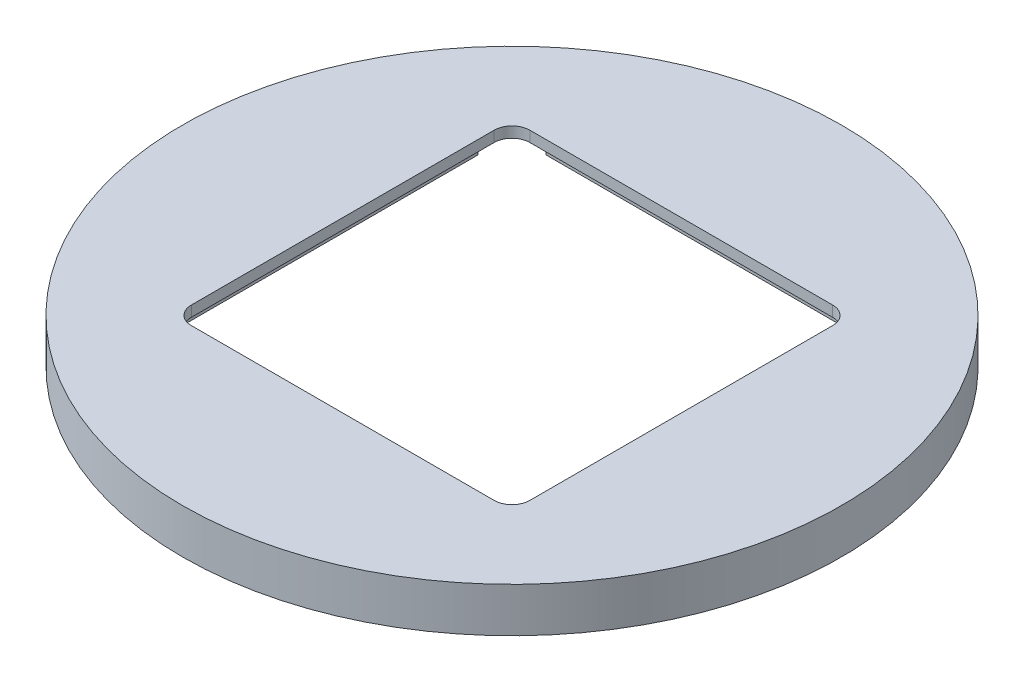
ISO-10303-21;
HEADER;
FILE_DESCRIPTION(('STEP AP214'),'2;1');
FILE_NAME('part.step','',(''),(''),'','','');
FILE_SCHEMA(('AUTOMOTIVE_DESIGN { 1 0 10303 214 1 1 1 1 }'));
ENDSEC;
DATA;
#1=APPLICATION_CONTEXT('core data for automotive mechanical design processes');
#2=APPLICATION_PROTOCOL_DEFINITION('international standard','automotive_design',2000,#1);
#3=PRODUCT_CONTEXT('',#1,'mechanical');
#4=PRODUCT('Part','Part','',(#3));
#5=PRODUCT_RELATED_PRODUCT_CATEGORY('part','',(#4));
#6=PRODUCT_DEFINITION_FORMATION('','',#4);
#7=PRODUCT_DEFINITION_CONTEXT('part definition',#1,'design');
#8=PRODUCT_DEFINITION('design','',#6,#7);
#9=PRODUCT_DEFINITION_SHAPE('','',#8);
#10=(LENGTH_UNIT() NAMED_UNIT(*) SI_UNIT(.MILLI.,.METRE.));
#11=(NAMED_UNIT(*) PLANE_ANGLE_UNIT() SI_UNIT($,.RADIAN.));
#12=(NAMED_UNIT(*) SI_UNIT($,.STERADIAN.) SOLID_ANGLE_UNIT());
#13=UNCERTAINTY_MEASURE_WITH_UNIT(LENGTH_MEASURE(1.E-05),#10,'distance_accuracy_value','');
#14=(GEOMETRIC_REPRESENTATION_CONTEXT(3) GLOBAL_UNCERTAINTY_ASSIGNED_CONTEXT((#13)) GLOBAL_UNIT_ASSIGNED_CONTEXT((#10,
#11,#12)) REPRESENTATION_CONTEXT('',''));
#15=CARTESIAN_POINT('',(0.,0.,0.));
#16=DIRECTION('',(0.,0.,1.));
#17=DIRECTION('',(1.,0.,0.));
#18=AXIS2_PLACEMENT_3D('',#15,#16,#17);
#19=CARTESIAN_POINT('',(-32.6337342069294,2.5,0.));
#20=DIRECTION('',(1.,0.,0.));
#21=DIRECTION('',(0.,0.,-1.));
#22=AXIS2_PLACEMENT_3D('',#19,#20,#21);
#23=PLANE('',#22);
#24=DIRECTION('',(0.,-1.,0.));
#25=VECTOR('',#24,1.);
#26=CARTESIAN_POINT('',(-32.6337342069294,6.14264068711932,-8.71443994882699));
#27=LINE('',#26,#25);
#28=CARTESIAN_POINT('',(-32.6337342069294,1.9,-8.71443994882699));
#29=VERTEX_POINT('',#28);
#30=CARTESIAN_POINT('',(-32.6337342069294,0.,-8.71443994882699));
#31=VERTEX_POINT('',#30);
#32=EDGE_CURVE('E52',#29,#31,#27,.T.);
#33=ORIENTED_EDGE('',*,*,#32,.F.);
#34=DIRECTION('',(0.,0.,-1.));
#35=VECTOR('',#34,1.);
#36=CARTESIAN_POINT('',(-32.6337342069294,1.9,0.));
#37=LINE('',#36,#35);
#38=CARTESIAN_POINT('',(-32.6337342069294,1.9,9.9571329264268));
#39=VERTEX_POINT('',#38);
#40=EDGE_CURVE('E257',#39,#29,#37,.T.);
#41=ORIENTED_EDGE('',*,*,#40,.F.);
#42=DIRECTION('',(0.,-1.,0.));
#43=VECTOR('',#42,1.);
#44=CARTESIAN_POINT('',(-32.6337342069294,6.14264068711932,9.9571329264268));
#45=LINE('',#44,#43);
#46=CARTESIAN_POINT('',(-32.6337342069294,0.,9.9571329264268));
#47=VERTEX_POINT('',#46);
#48=EDGE_CURVE('E249',#47,#39,#45,.F.);
#49=ORIENTED_EDGE('',*,*,#48,.F.);
#50=DIRECTION('',(0.,0.,1.));
#51=VECTOR('',#50,1.);
#52=CARTESIAN_POINT('',(-32.6337342069294,0.,0.));
#53=LINE('',#52,#51);
#54=EDGE_CURVE('E169',#31,#47,#53,.T.);
#55=ORIENTED_EDGE('',*,*,#54,.F.);
#56=EDGE_LOOP('',(#33,#41,#49,#55));
#57=FACE_BOUND('',#56,.T.);
#58=ADVANCED_FACE('F37',(#57),#23,.T.);
#59=CARTESIAN_POINT('',(0.,2.5,-10.6286535112001));
#60=DIRECTION('',(0.,0.,1.));
#61=DIRECTION('',(1.,0.,0.));
#62=AXIS2_PLACEMENT_3D('',#59,#60,#61);
#63=PLANE('',#62);
#64=DIRECTION('',(0.,-1.,0.));
#65=VECTOR('',#64,1.);
#66=CARTESIAN_POINT('',(-30.7195206445563,6.14264068711932,-10.6286535112001));
#67=LINE('',#66,#65);
#68=CARTESIAN_POINT('',(-30.7195206445563,0.,-10.6286535112001));
#69=VERTEX_POINT('',#68);
#70=CARTESIAN_POINT('',(-30.7195206445563,1.9,-10.6286535112001));
#71=VERTEX_POINT('',#70);
#72=EDGE_CURVE('E150',#69,#71,#67,.F.);
#73=ORIENTED_EDGE('',*,*,#72,.F.);
#74=DIRECTION('',(-1.,0.,0.));
#75=VECTOR('',#74,1.);
#76=CARTESIAN_POINT('',(0.,0.,-10.6286535112001));
#77=LINE('',#76,#75);
#78=CARTESIAN_POINT('',(-12.0479477693025,0.,-10.6286535112001));
#79=VERTEX_POINT('',#78);
#80=EDGE_CURVE('E161',#79,#69,#77,.T.);
#81=ORIENTED_EDGE('',*,*,#80,.F.);
#82=DIRECTION('',(0.,-1.,0.));
#83=VECTOR('',#82,1.);
#84=CARTESIAN_POINT('',(-12.0479477693025,6.14264068711932,-10.6286535112001));
#85=LINE('',#84,#83);
#86=CARTESIAN_POINT('',(-12.0479477693025,1.9,-10.6286535112001));
#87=VERTEX_POINT('',#86);
#88=EDGE_CURVE('E60',#87,#79,#85,.T.);
#89=ORIENTED_EDGE('',*,*,#88,.F.);
#90=DIRECTION('',(1.,0.,0.));
#91=VECTOR('',#90,1.);
#92=CARTESIAN_POINT('',(0.,1.9,-10.6286535112001));
#93=LINE('',#92,#91);
#94=EDGE_CURVE('E162',#71,#87,#93,.T.);
#95=ORIENTED_EDGE('',*,*,#94,.F.);
#96=EDGE_LOOP('',(#73,#81,#89,#95));
#97=FACE_BOUND('',#96,.T.);
#98=ADVANCED_FACE('F160',(#97),#63,.T.);
#99=CARTESIAN_POINT('',(-10.1337342069294,2.5,0.));
#100=DIRECTION('',(1.,0.,0.));
#101=DIRECTION('',(0.,0.,-1.));
#102=AXIS2_PLACEMENT_3D('',#99,#100,#101);
#103=PLANE('',#102);
#104=DIRECTION('',(0.,0.,1.));
#105=VECTOR('',#104,1.);
#106=CARTESIAN_POINT('',(-10.1337342069294,1.9,0.));
#107=LINE('',#106,#105);
#108=CARTESIAN_POINT('',(-10.1337342069295,1.9,-8.71443994882699));
#109=VERTEX_POINT('',#108);
#110=CARTESIAN_POINT('',(-10.1337342069294,1.9,9.95713292642681));
#111=VERTEX_POINT('',#110);
#112=EDGE_CURVE('E262',#109,#111,#107,.T.);
#113=ORIENTED_EDGE('',*,*,#112,.F.);
#114=DIRECTION('',(0.,-1.,0.));
#115=VECTOR('',#114,1.);
#116=CARTESIAN_POINT('',(-10.1337342069295,6.14264068711932,-8.71443994882699));
#117=LINE('',#116,#115);
#118=CARTESIAN_POINT('',(-10.1337342069295,0.,-8.71443994882699));
#119=VERTEX_POINT('',#118);
#120=EDGE_CURVE('E584',#109,#119,#117,.T.);
#121=ORIENTED_EDGE('',*,*,#120,.T.);
#122=DIRECTION('',(0.,0.,1.));
#123=VECTOR('',#122,1.);
#124=CARTESIAN_POINT('',(-10.1337342069294,0.,0.));
#125=LINE('',#124,#123);
#126=CARTESIAN_POINT('',(-10.1337342069294,0.,9.95713292642681));
#127=VERTEX_POINT('',#126);
#128=EDGE_CURVE('E168',#119,#127,#125,.T.);
#129=ORIENTED_EDGE('',*,*,#128,.T.);
#130=DIRECTION('',(0.,-1.,0.));
#131=VECTOR('',#130,1.);
#132=CARTESIAN_POINT('',(-10.1337342069294,6.14264068711932,9.95713292642681));
#133=LINE('',#132,#131);
#134=EDGE_CURVE('E557',#127,#111,#133,.F.);
#135=ORIENTED_EDGE('',*,*,#134,.T.);
#136=EDGE_LOOP('',(#113,#121,#129,#135));
#137=FACE_BOUND('',#136,.T.);
#138=ADVANCED_FACE('F320',(#137),#103,.F.);
#139=CARTESIAN_POINT('',(0.,2.5,11.8713464887999));
#140=DIRECTION('',(0.,0.,1.));
#141=DIRECTION('',(1.,0.,0.));
#142=AXIS2_PLACEMENT_3D('',#139,#140,#141);
#143=PLANE('',#142);
#144=DIRECTION('',(-1.,0.,0.));
#145=VECTOR('',#144,1.);
#146=CARTESIAN_POINT('',(0.,1.9,11.8713464887999));
#147=LINE('',#146,#145);
#148=CARTESIAN_POINT('',(-12.0479477693025,1.9,11.8713464887999));
#149=VERTEX_POINT('',#148);
#150=CARTESIAN_POINT('',(-30.7195206445563,1.9,11.8713464887999));
#151=VERTEX_POINT('',#150);
#152=EDGE_CURVE('E260',#149,#151,#147,.T.);
#153=ORIENTED_EDGE('',*,*,#152,.F.);
#154=DIRECTION('',(0.,-1.,0.));
#155=VECTOR('',#154,1.);
#156=CARTESIAN_POINT('',(-12.0479477693025,6.14264068711932,11.8713464887999));
#157=LINE('',#156,#155);
#158=CARTESIAN_POINT('',(-12.0479477693025,0.,11.8713464887999));
#159=VERTEX_POINT('',#158);
#160=EDGE_CURVE('E554',#149,#159,#157,.T.);
#161=ORIENTED_EDGE('',*,*,#160,.T.);
#162=DIRECTION('',(-1.,0.,0.));
#163=VECTOR('',#162,1.);
#164=CARTESIAN_POINT('',(0.,0.,11.8713464887999));
#165=LINE('',#164,#163);
#166=CARTESIAN_POINT('',(-30.7195206445563,0.,11.8713464887999));
#167=VERTEX_POINT('',#166);
#168=EDGE_CURVE('E171',#159,#167,#165,.T.);
#169=ORIENTED_EDGE('',*,*,#168,.T.);
#170=DIRECTION('',(0.,-1.,0.));
#171=VECTOR('',#170,1.);
#172=CARTESIAN_POINT('',(-30.7195206445563,6.14264068711932,11.8713464887999));
#173=LINE('',#172,#171);
#174=EDGE_CURVE('E572',#167,#151,#173,.F.);
#175=ORIENTED_EDGE('',*,*,#174,.T.);
#176=EDGE_LOOP('',(#153,#161,#169,#175));
#177=FACE_BOUND('',#176,.T.);
#178=ADVANCED_FACE('F297',(#177),#143,.F.);
#179=CARTESIAN_POINT('',(-21.3837342069294,2.5,0.621346488799904));
#180=DIRECTION('',(0.,-1.,0.));
#181=DIRECTION('',(0.,0.,-1.));
#182=AXIS2_PLACEMENT_3D('',#179,#180,#181);
#183=CYLINDRICAL_SURFACE('',#182,18.5);
#184=CARTESIAN_POINT('',(-21.3837342069294,2.5,0.621346488799904));
#185=DIRECTION('',(0.,1.,0.));
#186=DIRECTION('',(0.,0.,1.));
#187=AXIS2_PLACEMENT_3D('',#184,#185,#186);
#188=CIRCLE('',#187,18.5);
#189=CARTESIAN_POINT('',(-21.3837342069294,2.5,19.1213464887999));
#190=VERTEX_POINT('',#189);
#191=EDGE_CURVE('E181',#190,#190,#188,.T.);
#192=ORIENTED_EDGE('',*,*,#191,.F.);
#193=EDGE_LOOP('',(#192));
#194=FACE_BOUND('',#193,.T.);
#195=CARTESIAN_POINT('',(-21.3837342069294,0.,0.621346488799904));
#196=DIRECTION('',(0.,1.,0.));
#197=DIRECTION('',(0.,0.,1.));
#198=AXIS2_PLACEMENT_3D('',#195,#196,#197);
#199=CIRCLE('',#198,18.5);
#200=CARTESIAN_POINT('',(-21.3837342069294,0.,19.1213464887999));
#201=VERTEX_POINT('',#200);
#202=EDGE_CURVE('E178',#201,#201,#199,.T.);
#203=ORIENTED_EDGE('',*,*,#202,.T.);
#204=EDGE_LOOP('',(#203));
#205=FACE_BOUND('',#204,.T.);
#206=ADVANCED_FACE('F294',(#194,#205),#183,.T.);
#207=CARTESIAN_POINT('',(0.,2.5,0.));
#208=DIRECTION('',(0.,1.,0.));
#209=DIRECTION('',(0.,0.,1.));
#210=AXIS2_PLACEMENT_3D('',#207,#208,#209);
#211=PLANE('',#210);
#212=ORIENTED_EDGE('',*,*,#191,.T.);
#213=EDGE_LOOP('',(#212));
#214=FACE_BOUND('',#213,.T.);
#215=DIRECTION('',(0.,0.,1.));
#216=VECTOR('',#215,1.);
#217=CARTESIAN_POINT('',(-30.8837342069294,2.5,0.));
#218=LINE('',#217,#216);
#219=CARTESIAN_POINT('',(-30.8837342069294,2.5,-7.87865351120009));
#220=VERTEX_POINT('',#219);
#221=CARTESIAN_POINT('',(-30.8837342069294,2.5,9.12134648879991));
#222=VERTEX_POINT('',#221);
#223=EDGE_CURVE('E220',#220,#222,#218,.T.);
#224=ORIENTED_EDGE('',*,*,#223,.F.);
#225=CARTESIAN_POINT('',(-29.8837342069294,2.5,-7.87865351120009));
#226=DIRECTION('',(0.,1.,0.));
#227=DIRECTION('',(0.,0.,1.));
#228=AXIS2_PLACEMENT_3D('',#225,#226,#227);
#229=CIRCLE('',#228,1.);
#230=CARTESIAN_POINT('',(-29.8837342069294,2.5,-8.87865351120009));
#231=VERTEX_POINT('',#230);
#232=EDGE_CURVE('E45',#220,#231,#229,.F.);
#233=ORIENTED_EDGE('',*,*,#232,.T.);
#234=DIRECTION('',(-1.,0.,0.));
#235=VECTOR('',#234,1.);
#236=CARTESIAN_POINT('',(0.,2.5,-8.8786535112001));
#237=LINE('',#236,#235);
#238=CARTESIAN_POINT('',(-12.8837342069294,2.5,-8.87865351120009));
#239=VERTEX_POINT('',#238);
#240=EDGE_CURVE('E218',#239,#231,#237,.T.);
#241=ORIENTED_EDGE('',*,*,#240,.F.);
#242=CARTESIAN_POINT('',(-12.8837342069294,2.5,-7.87865351120009));
#243=DIRECTION('',(0.,1.,0.));
#244=DIRECTION('',(0.,0.,1.));
#245=AXIS2_PLACEMENT_3D('',#242,#243,#244);
#246=CIRCLE('',#245,1.);
#247=CARTESIAN_POINT('',(-11.8837342069294,2.5,-7.87865351120009));
#248=VERTEX_POINT('',#247);
#249=EDGE_CURVE('E210',#239,#248,#246,.F.);
#250=ORIENTED_EDGE('',*,*,#249,.T.);
#251=DIRECTION('',(0.,0.,1.));
#252=VECTOR('',#251,1.);
#253=CARTESIAN_POINT('',(-11.8837342069294,2.5,0.));
#254=LINE('',#253,#252);
#255=CARTESIAN_POINT('',(-11.8837342069294,2.5,9.12134648879991));
#256=VERTEX_POINT('',#255);
#257=EDGE_CURVE('E229',#248,#256,#254,.T.);
#258=ORIENTED_EDGE('',*,*,#257,.T.);
#259=CARTESIAN_POINT('',(-12.8837342069294,2.5,9.12134648879991));
#260=DIRECTION('',(0.,1.,0.));
#261=DIRECTION('',(0.,0.,1.));
#262=AXIS2_PLACEMENT_3D('',#259,#260,#261);
#263=CIRCLE('',#262,1.);
#264=CARTESIAN_POINT('',(-12.8837342069294,2.5,10.1213464887999));
#265=VERTEX_POINT('',#264);
#266=EDGE_CURVE('E206',#256,#265,#263,.F.);
#267=ORIENTED_EDGE('',*,*,#266,.T.);
#268=DIRECTION('',(-1.,0.,0.));
#269=VECTOR('',#268,1.);
#270=CARTESIAN_POINT('',(0.,2.5,10.1213464887999));
#271=LINE('',#270,#269);
#272=CARTESIAN_POINT('',(-29.8837342069294,2.5,10.1213464887999));
#273=VERTEX_POINT('',#272);
#274=EDGE_CURVE('E242',#265,#273,#271,.T.);
#275=ORIENTED_EDGE('',*,*,#274,.T.);
#276=CARTESIAN_POINT('',(-29.8837342069294,2.5,9.12134648879991));
#277=DIRECTION('',(0.,1.,0.));
#278=DIRECTION('',(0.,0.,1.));
#279=AXIS2_PLACEMENT_3D('',#276,#277,#278);
#280=CIRCLE('',#279,1.);
#281=EDGE_CURVE('E202',#273,#222,#280,.F.);
#282=ORIENTED_EDGE('',*,*,#281,.T.);
#283=EDGE_LOOP('',(#224,#233,#241,#250,#258,#267,#275,#282));
#284=FACE_BOUND('',#283,.T.);
#285=ADVANCED_FACE('F217',(#214,#284),#211,.T.);
#286=CARTESIAN_POINT('',(0.,0.,0.));
#287=DIRECTION('',(0.,1.,0.));
#288=DIRECTION('',(0.,0.,1.));
#289=AXIS2_PLACEMENT_3D('',#286,#287,#288);
#290=PLANE('',#289);
#291=CARTESIAN_POINT('',(-37.1637342069294,0.,0.435404850908237));
#292=DIRECTION('',(0.,-1.,0.));
#293=DIRECTION('',(1.,0.,0.));
#294=AXIS2_PLACEMENT_3D('',#291,#292,#293);
#295=CIRCLE('',#294,1.67000000000001);
#296=CARTESIAN_POINT('',(-35.4937342069294,0.,0.435404850908219));
#297=VERTEX_POINT('',#296);
#298=EDGE_CURVE('E265',#297,#297,#295,.T.);
#299=ORIENTED_EDGE('',*,*,#298,.F.);
#300=EDGE_LOOP('',(#299));
#301=FACE_BOUND('',#300,.T.);
#302=CARTESIAN_POINT('',(-21.1977925690376,0.,-15.1586535112001));
#303=DIRECTION('',(0.,-1.,0.));
#304=DIRECTION('',(0.,0.,1.));
#305=AXIS2_PLACEMENT_3D('',#302,#303,#304);
#306=CIRCLE('',#305,1.67000000000001);
#307=CARTESIAN_POINT('',(-21.1977925690376,0.,-13.4886535112001));
#308=VERTEX_POINT('',#307);
#309=EDGE_CURVE('E272',#308,#308,#306,.T.);
#310=ORIENTED_EDGE('',*,*,#309,.F.);
#311=EDGE_LOOP('',(#310));
#312=FACE_BOUND('',#311,.T.);
#313=CARTESIAN_POINT('',(-5.60373420692944,0.,0.807288126691685));
#314=DIRECTION('',(0.,-1.,0.));
#315=DIRECTION('',(-1.,0.,0.));
#316=AXIS2_PLACEMENT_3D('',#313,#314,#315);
#317=CIRCLE('',#316,1.67000000000001);
#318=CARTESIAN_POINT('',(-7.27373420692945,0.,0.80728812669169));
#319=VERTEX_POINT('',#318);
#320=EDGE_CURVE('E278',#319,#319,#317,.T.);
#321=ORIENTED_EDGE('',*,*,#320,.F.);
#322=EDGE_LOOP('',(#321));
#323=FACE_BOUND('',#322,.T.);
#324=CARTESIAN_POINT('',(-21.5696758448213,0.,16.4013464887999));
#325=DIRECTION('',(0.,-1.,0.));
#326=DIRECTION('',(0.,0.,-1.));
#327=AXIS2_PLACEMENT_3D('',#324,#325,#326);
#328=CIRCLE('',#327,1.67000000000001);
#329=CARTESIAN_POINT('',(-21.5696758448213,0.,14.7313464887999));
#330=VERTEX_POINT('',#329);
#331=EDGE_CURVE('E284',#330,#330,#328,.T.);
#332=ORIENTED_EDGE('',*,*,#331,.F.);
#333=EDGE_LOOP('',(#332));
#334=FACE_BOUND('',#333,.T.);
#335=ORIENTED_EDGE('',*,*,#80,.T.);
#336=CARTESIAN_POINT('',(-32.1337342069294,0.,-10.1286535112001));
#337=DIRECTION('',(0.,-1.,0.));
#338=DIRECTION('',(0.,0.,-1.));
#339=AXIS2_PLACEMENT_3D('',#336,#337,#338);
#340=CIRCLE('',#339,1.50000000000001);
#341=EDGE_CURVE('E147',#31,#69,#340,.T.);
#342=ORIENTED_EDGE('',*,*,#341,.F.);
#343=ORIENTED_EDGE('',*,*,#54,.T.);
#344=CARTESIAN_POINT('',(-32.1337342069294,0.,11.3713464887999));
#345=DIRECTION('',(0.,-1.,0.));
#346=DIRECTION('',(0.,0.,-1.));
#347=AXIS2_PLACEMENT_3D('',#344,#345,#346);
#348=CIRCLE('',#347,1.5);
#349=EDGE_CURVE('E567',#167,#47,#348,.T.);
#350=ORIENTED_EDGE('',*,*,#349,.F.);
#351=ORIENTED_EDGE('',*,*,#168,.F.);
#352=CARTESIAN_POINT('',(-10.6337342069294,0.,11.3713464887999));
#353=DIRECTION('',(0.,-1.,0.));
#354=DIRECTION('',(0.,0.,-1.));
#355=AXIS2_PLACEMENT_3D('',#352,#353,#354);
#356=CIRCLE('',#355,1.5);
#357=EDGE_CURVE('E551',#127,#159,#356,.T.);
#358=ORIENTED_EDGE('',*,*,#357,.F.);
#359=ORIENTED_EDGE('',*,*,#128,.F.);
#360=CARTESIAN_POINT('',(-10.6337342069294,0.,-10.1286535112001));
#361=DIRECTION('',(0.,-1.,0.));
#362=DIRECTION('',(0.,0.,-1.));
#363=AXIS2_PLACEMENT_3D('',#360,#361,#362);
#364=CIRCLE('',#363,1.5);
#365=EDGE_CURVE('E167',#79,#119,#364,.T.);
#366=ORIENTED_EDGE('',*,*,#365,.F.);
#367=EDGE_LOOP('',(#335,#342,#343,#350,#351,#358,#359,#366));
#368=FACE_BOUND('',#367,.T.);
#369=ORIENTED_EDGE('',*,*,#202,.F.);
#370=EDGE_LOOP('',(#369));
#371=FACE_BOUND('',#370,.T.);
#372=ADVANCED_FACE('F164',(#301,#312,#323,#334,#368,#371),#290,.F.);
#373=CARTESIAN_POINT('',(-21.5696758448213,1.15,16.4013464887999));
#374=DIRECTION('',(0.,-1.,0.));
#375=DIRECTION('',(0.,0.,-1.));
#376=AXIS2_PLACEMENT_3D('',#373,#374,#375);
#377=CYLINDRICAL_SURFACE('',#376,1.67000000000001);
#378=CARTESIAN_POINT('',(-21.5696758448213,1.15,16.4013464887999));
#379=DIRECTION('',(0.,-1.,0.));
#380=DIRECTION('',(0.,0.,-1.));
#381=AXIS2_PLACEMENT_3D('',#378,#379,#380);
#382=CIRCLE('',#381,1.67000000000001);
#383=CARTESIAN_POINT('',(-21.5696758448213,1.15,14.7313464887999));
#384=VERTEX_POINT('',#383);
#385=EDGE_CURVE('E173',#384,#384,#382,.T.);
#386=ORIENTED_EDGE('',*,*,#385,.F.);
#387=EDGE_LOOP('',(#386));
#388=FACE_BOUND('',#387,.T.);
#389=ORIENTED_EDGE('',*,*,#331,.T.);
#390=EDGE_LOOP('',(#389));
#391=FACE_BOUND('',#390,.T.);
#392=ADVANCED_FACE('F301',(#388,#391),#377,.F.);
#393=CARTESIAN_POINT('',(-21.5696758448213,1.15,16.4013464887999));
#394=DIRECTION('',(0.,-1.,0.));
#395=DIRECTION('',(0.,0.,-1.));
#396=AXIS2_PLACEMENT_3D('',#393,#394,#395);
#397=PLANE('',#396);
#398=ORIENTED_EDGE('',*,*,#385,.T.);
#399=EDGE_LOOP('',(#398));
#400=FACE_BOUND('',#399,.T.);
#401=ADVANCED_FACE('F308',(#400),#397,.T.);
#402=CARTESIAN_POINT('',(-5.60373420692944,1.15,0.807288126691685));
#403=DIRECTION('',(0.,-1.,0.));
#404=DIRECTION('',(0.,0.,-1.));
#405=AXIS2_PLACEMENT_3D('',#402,#403,#404);
#406=CYLINDRICAL_SURFACE('',#405,1.67000000000001);
#407=CARTESIAN_POINT('',(-5.60373420692944,1.15,0.807288126691685));
#408=DIRECTION('',(0.,-1.,0.));
#409=DIRECTION('',(-1.,0.,0.));
#410=AXIS2_PLACEMENT_3D('',#407,#408,#409);
#411=CIRCLE('',#410,1.67000000000001);
#412=CARTESIAN_POINT('',(-7.27373420692945,1.15,0.80728812669169));
#413=VERTEX_POINT('',#412);
#414=EDGE_CURVE('E281',#413,#413,#411,.T.);
#415=ORIENTED_EDGE('',*,*,#414,.F.);
#416=EDGE_LOOP('',(#415));
#417=FACE_BOUND('',#416,.T.);
#418=ORIENTED_EDGE('',*,*,#320,.T.);
#419=EDGE_LOOP('',(#418));
#420=FACE_BOUND('',#419,.T.);
#421=ADVANCED_FACE('F384',(#417,#420),#406,.F.);
#422=CARTESIAN_POINT('',(-5.60373420692944,1.15,0.807288126691685));
#423=DIRECTION('',(0.,-1.,0.));
#424=DIRECTION('',(-1.,0.,0.));
#425=AXIS2_PLACEMENT_3D('',#422,#423,#424);
#426=PLANE('',#425);
#427=ORIENTED_EDGE('',*,*,#414,.T.);
#428=EDGE_LOOP('',(#427));
#429=FACE_BOUND('',#428,.T.);
#430=ADVANCED_FACE('F380',(#429),#426,.T.);
#431=CARTESIAN_POINT('',(-21.1977925690376,1.15,-15.1586535112001));
#432=DIRECTION('',(0.,-1.,0.));
#433=DIRECTION('',(0.,0.,-1.));
#434=AXIS2_PLACEMENT_3D('',#431,#432,#433);
#435=CYLINDRICAL_SURFACE('',#434,1.67000000000001);
#436=CARTESIAN_POINT('',(-21.1977925690376,1.15,-15.1586535112001));
#437=DIRECTION('',(0.,-1.,0.));
#438=DIRECTION('',(0.,0.,1.));
#439=AXIS2_PLACEMENT_3D('',#436,#437,#438);
#440=CIRCLE('',#439,1.67000000000001);
#441=CARTESIAN_POINT('',(-21.1977925690376,1.15,-13.4886535112001));
#442=VERTEX_POINT('',#441);
#443=EDGE_CURVE('E275',#442,#442,#440,.T.);
#444=ORIENTED_EDGE('',*,*,#443,.F.);
#445=EDGE_LOOP('',(#444));
#446=FACE_BOUND('',#445,.T.);
#447=ORIENTED_EDGE('',*,*,#309,.T.);
#448=EDGE_LOOP('',(#447));
#449=FACE_BOUND('',#448,.T.);
#450=ADVANCED_FACE('F376',(#446,#449),#435,.F.);
#451=CARTESIAN_POINT('',(-21.1977925690376,1.15,-15.1586535112001));
#452=DIRECTION('',(0.,-1.,0.));
#453=DIRECTION('',(0.,0.,1.));
#454=AXIS2_PLACEMENT_3D('',#451,#452,#453);
#455=PLANE('',#454);
#456=ORIENTED_EDGE('',*,*,#443,.T.);
#457=EDGE_LOOP('',(#456));
#458=FACE_BOUND('',#457,.T.);
#459=ADVANCED_FACE('F372',(#458),#455,.T.);
#460=CARTESIAN_POINT('',(-37.1637342069294,1.15,0.435404850908237));
#461=DIRECTION('',(0.,-1.,0.));
#462=DIRECTION('',(0.,0.,-1.));
#463=AXIS2_PLACEMENT_3D('',#460,#461,#462);
#464=CYLINDRICAL_SURFACE('',#463,1.67000000000001);
#465=CARTESIAN_POINT('',(-37.1637342069294,1.15,0.435404850908237));
#466=DIRECTION('',(0.,-1.,0.));
#467=DIRECTION('',(1.,0.,0.));
#468=AXIS2_PLACEMENT_3D('',#465,#466,#467);
#469=CIRCLE('',#468,1.67000000000001);
#470=CARTESIAN_POINT('',(-35.4937342069294,1.15,0.435404850908219));
#471=VERTEX_POINT('',#470);
#472=EDGE_CURVE('E269',#471,#471,#469,.T.);
#473=ORIENTED_EDGE('',*,*,#472,.F.);
#474=EDGE_LOOP('',(#473));
#475=FACE_BOUND('',#474,.T.);
#476=ORIENTED_EDGE('',*,*,#298,.T.);
#477=EDGE_LOOP('',(#476));
#478=FACE_BOUND('',#477,.T.);
#479=ADVANCED_FACE('F368',(#475,#478),#464,.F.);
#480=CARTESIAN_POINT('',(-37.1637342069294,1.15,0.435404850908237));
#481=DIRECTION('',(0.,-1.,0.));
#482=DIRECTION('',(1.,0.,0.));
#483=AXIS2_PLACEMENT_3D('',#480,#481,#482);
#484=PLANE('',#483);
#485=ORIENTED_EDGE('',*,*,#472,.T.);
#486=EDGE_LOOP('',(#485));
#487=FACE_BOUND('',#486,.T.);
#488=ADVANCED_FACE('F359',(#487),#484,.T.);
#489=CARTESIAN_POINT('',(-30.8837342069294,1.9,0.));
#490=DIRECTION('',(-1.,0.,0.));
#491=DIRECTION('',(0.,0.,1.));
#492=AXIS2_PLACEMENT_3D('',#489,#490,#491);
#493=PLANE('',#492);
#494=ORIENTED_EDGE('',*,*,#223,.T.);
#495=DIRECTION('',(0.,1.,0.));
#496=VECTOR('',#495,1.);
#497=CARTESIAN_POINT('',(-30.8837342069294,1.9,9.12134648879991));
#498=LINE('',#497,#496);
#499=CARTESIAN_POINT('',(-30.8837342069294,1.9,9.12134648879991));
#500=VERTEX_POINT('',#499);
#501=EDGE_CURVE('E190',#222,#500,#498,.F.);
#502=ORIENTED_EDGE('',*,*,#501,.T.);
#503=DIRECTION('',(0.,0.,1.));
#504=VECTOR('',#503,1.);
#505=CARTESIAN_POINT('',(-30.8837342069294,1.9,0.));
#506=LINE('',#505,#504);
#507=CARTESIAN_POINT('',(-30.8837342069294,1.9,-7.87865351120009));
#508=VERTEX_POINT('',#507);
#509=EDGE_CURVE('E236',#508,#500,#506,.T.);
#510=ORIENTED_EDGE('',*,*,#509,.F.);
#511=DIRECTION('',(0.,1.,0.));
#512=VECTOR('',#511,1.);
#513=CARTESIAN_POINT('',(-30.8837342069294,2.5,-7.87865351120009));
#514=LINE('',#513,#512);
#515=EDGE_CURVE('E187',#508,#220,#514,.T.);
#516=ORIENTED_EDGE('',*,*,#515,.T.);
#517=EDGE_LOOP('',(#494,#502,#510,#516));
#518=FACE_BOUND('',#517,.T.);
#519=ADVANCED_FACE('F240',(#518),#493,.F.);
#520=CARTESIAN_POINT('',(0.,1.9,10.1213464887999));
#521=DIRECTION('',(0.,0.,-1.));
#522=DIRECTION('',(-1.,0.,0.));
#523=AXIS2_PLACEMENT_3D('',#520,#521,#522);
#524=PLANE('',#523);
#525=DIRECTION('',(-1.,0.,0.));
#526=VECTOR('',#525,1.);
#527=CARTESIAN_POINT('',(0.,1.9,10.1213464887999));
#528=LINE('',#527,#526);
#529=CARTESIAN_POINT('',(-12.8837342069294,1.9,10.1213464887999));
#530=VERTEX_POINT('',#529);
#531=CARTESIAN_POINT('',(-29.8837342069294,1.9,10.1213464887999));
#532=VERTEX_POINT('',#531);
#533=EDGE_CURVE('E254',#530,#532,#528,.T.);
#534=ORIENTED_EDGE('',*,*,#533,.T.);
#535=DIRECTION('',(0.,1.,0.));
#536=VECTOR('',#535,1.);
#537=CARTESIAN_POINT('',(-29.8837342069294,1.9,10.1213464887999));
#538=LINE('',#537,#536);
#539=EDGE_CURVE('E184',#532,#273,#538,.T.);
#540=ORIENTED_EDGE('',*,*,#539,.T.);
#541=ORIENTED_EDGE('',*,*,#274,.F.);
#542=DIRECTION('',(0.,1.,0.));
#543=VECTOR('',#542,1.);
#544=CARTESIAN_POINT('',(-12.8837342069294,1.9,10.1213464887999));
#545=LINE('',#544,#543);
#546=EDGE_CURVE('E182',#265,#530,#545,.F.);
#547=ORIENTED_EDGE('',*,*,#546,.T.);
#548=EDGE_LOOP('',(#534,#540,#541,#547));
#549=FACE_BOUND('',#548,.T.);
#550=ADVANCED_FACE('F350',(#549),#524,.T.);
#551=CARTESIAN_POINT('',(-11.8837342069294,1.9,0.));
#552=DIRECTION('',(-1.,0.,0.));
#553=DIRECTION('',(0.,0.,1.));
#554=AXIS2_PLACEMENT_3D('',#551,#552,#553);
#555=PLANE('',#554);
#556=DIRECTION('',(0.,0.,1.));
#557=VECTOR('',#556,1.);
#558=CARTESIAN_POINT('',(-11.8837342069294,1.9,0.));
#559=LINE('',#558,#557);
#560=CARTESIAN_POINT('',(-11.8837342069294,1.9,-7.87865351120009));
#561=VERTEX_POINT('',#560);
#562=CARTESIAN_POINT('',(-11.8837342069294,1.9,9.12134648879991));
#563=VERTEX_POINT('',#562);
#564=EDGE_CURVE('E244',#561,#563,#559,.T.);
#565=ORIENTED_EDGE('',*,*,#564,.T.);
#566=DIRECTION('',(0.,1.,0.));
#567=VECTOR('',#566,1.);
#568=CARTESIAN_POINT('',(-11.8837342069294,2.5,9.12134648879991));
#569=LINE('',#568,#567);
#570=EDGE_CURVE('E194',#563,#256,#569,.T.);
#571=ORIENTED_EDGE('',*,*,#570,.T.);
#572=ORIENTED_EDGE('',*,*,#257,.F.);
#573=DIRECTION('',(0.,1.,0.));
#574=VECTOR('',#573,1.);
#575=CARTESIAN_POINT('',(-11.8837342069294,1.9,-7.87865351120009));
#576=LINE('',#575,#574);
#577=EDGE_CURVE('E192',#248,#561,#576,.F.);
#578=ORIENTED_EDGE('',*,*,#577,.T.);
#579=EDGE_LOOP('',(#565,#571,#572,#578));
#580=FACE_BOUND('',#579,.T.);
#581=ADVANCED_FACE('F345',(#580),#555,.T.);
#582=CARTESIAN_POINT('',(0.,1.9,-8.8786535112001));
#583=DIRECTION('',(0.,0.,-1.));
#584=DIRECTION('',(-1.,0.,0.));
#585=AXIS2_PLACEMENT_3D('',#582,#583,#584);
#586=PLANE('',#585);
#587=DIRECTION('',(-1.,0.,0.));
#588=VECTOR('',#587,1.);
#589=CARTESIAN_POINT('',(0.,1.9,-8.8786535112001));
#590=LINE('',#589,#588);
#591=CARTESIAN_POINT('',(-12.8837342069294,1.9,-8.87865351120009));
#592=VERTEX_POINT('',#591);
#593=CARTESIAN_POINT('',(-29.8837342069294,1.9,-8.87865351120009));
#594=VERTEX_POINT('',#593);
#595=EDGE_CURVE('E238',#592,#594,#590,.T.);
#596=ORIENTED_EDGE('',*,*,#595,.F.);
#597=DIRECTION('',(0.,1.,0.));
#598=VECTOR('',#597,1.);
#599=CARTESIAN_POINT('',(-12.8837342069294,1.9,-8.87865351120009));
#600=LINE('',#599,#598);
#601=EDGE_CURVE('E199',#592,#239,#600,.T.);
#602=ORIENTED_EDGE('',*,*,#601,.T.);
#603=ORIENTED_EDGE('',*,*,#240,.T.);
#604=DIRECTION('',(0.,1.,0.));
#605=VECTOR('',#604,1.);
#606=CARTESIAN_POINT('',(-29.8837342069294,1.9,-8.87865351120009));
#607=LINE('',#606,#605);
#608=EDGE_CURVE('E197',#231,#594,#607,.F.);
#609=ORIENTED_EDGE('',*,*,#608,.T.);
#610=EDGE_LOOP('',(#596,#602,#603,#609));
#611=FACE_BOUND('',#610,.T.);
#612=ADVANCED_FACE('F226',(#611),#586,.F.);
#613=CARTESIAN_POINT('',(0.,1.9,0.));
#614=DIRECTION('',(0.,1.,0.));
#615=DIRECTION('',(0.,0.,1.));
#616=AXIS2_PLACEMENT_3D('',#613,#614,#615);
#617=PLANE('',#616);
#618=ORIENTED_EDGE('',*,*,#40,.T.);
#619=CARTESIAN_POINT('',(-32.1337342069294,1.9,-10.1286535112001));
#620=DIRECTION('',(0.,1.,0.));
#621=DIRECTION('',(0.,0.,1.));
#622=AXIS2_PLACEMENT_3D('',#619,#620,#621);
#623=CIRCLE('',#622,1.50000000000001);
#624=EDGE_CURVE('E155',#29,#71,#623,.F.);
#625=ORIENTED_EDGE('',*,*,#624,.T.);
#626=ORIENTED_EDGE('',*,*,#94,.T.);
#627=CARTESIAN_POINT('',(-10.6337342069294,1.9,-10.1286535112001));
#628=DIRECTION('',(0.,1.,0.));
#629=DIRECTION('',(0.,0.,1.));
#630=AXIS2_PLACEMENT_3D('',#627,#628,#629);
#631=CIRCLE('',#630,1.5);
#632=EDGE_CURVE('E578',#87,#109,#631,.F.);
#633=ORIENTED_EDGE('',*,*,#632,.T.);
#634=ORIENTED_EDGE('',*,*,#112,.T.);
#635=CARTESIAN_POINT('',(-10.6337342069294,1.9,11.3713464887999));
#636=DIRECTION('',(0.,1.,0.));
#637=DIRECTION('',(0.,0.,1.));
#638=AXIS2_PLACEMENT_3D('',#635,#636,#637);
#639=CIRCLE('',#638,1.5);
#640=EDGE_CURVE('E559',#111,#149,#639,.F.);
#641=ORIENTED_EDGE('',*,*,#640,.T.);
#642=ORIENTED_EDGE('',*,*,#152,.T.);
#643=CARTESIAN_POINT('',(-32.1337342069294,1.9,11.3713464887999));
#644=DIRECTION('',(0.,1.,0.));
#645=DIRECTION('',(0.,0.,1.));
#646=AXIS2_PLACEMENT_3D('',#643,#644,#645);
#647=CIRCLE('',#646,1.5);
#648=EDGE_CURVE('E569',#151,#39,#647,.F.);
#649=ORIENTED_EDGE('',*,*,#648,.T.);
#650=EDGE_LOOP('',(#618,#625,#626,#633,#634,#641,#642,#649));
#651=FACE_BOUND('',#650,.T.);
#652=ORIENTED_EDGE('',*,*,#595,.T.);
#653=CARTESIAN_POINT('',(-29.8837342069294,1.9,-7.87865351120009));
#654=DIRECTION('',(0.,1.,0.));
#655=DIRECTION('',(0.,0.,1.));
#656=AXIS2_PLACEMENT_3D('',#653,#654,#655);
#657=CIRCLE('',#656,1.);
#658=EDGE_CURVE('E11',#594,#508,#657,.T.);
#659=ORIENTED_EDGE('',*,*,#658,.T.);
#660=ORIENTED_EDGE('',*,*,#509,.T.);
#661=CARTESIAN_POINT('',(-29.8837342069294,1.9,9.12134648879991));
#662=DIRECTION('',(0.,1.,0.));
#663=DIRECTION('',(0.,0.,1.));
#664=AXIS2_PLACEMENT_3D('',#661,#662,#663);
#665=CIRCLE('',#664,1.);
#666=EDGE_CURVE('E204',#500,#532,#665,.T.);
#667=ORIENTED_EDGE('',*,*,#666,.T.);
#668=ORIENTED_EDGE('',*,*,#533,.F.);
#669=CARTESIAN_POINT('',(-12.8837342069294,1.9,9.12134648879991));
#670=DIRECTION('',(0.,1.,0.));
#671=DIRECTION('',(0.,0.,1.));
#672=AXIS2_PLACEMENT_3D('',#669,#670,#671);
#673=CIRCLE('',#672,1.);
#674=EDGE_CURVE('E208',#530,#563,#673,.T.);
#675=ORIENTED_EDGE('',*,*,#674,.T.);
#676=ORIENTED_EDGE('',*,*,#564,.F.);
#677=CARTESIAN_POINT('',(-12.8837342069294,1.9,-7.87865351120009));
#678=DIRECTION('',(0.,1.,0.));
#679=DIRECTION('',(0.,0.,1.));
#680=AXIS2_PLACEMENT_3D('',#677,#678,#679);
#681=CIRCLE('',#680,1.);
#682=EDGE_CURVE('E212',#561,#592,#681,.T.);
#683=ORIENTED_EDGE('',*,*,#682,.T.);
#684=EDGE_LOOP('',(#652,#659,#660,#667,#668,#675,#676,#683));
#685=FACE_BOUND('',#684,.T.);
#686=ADVANCED_FACE('F235',(#651,#685),#617,.F.);
#687=CARTESIAN_POINT('',(-29.8837342069294,1.9,9.12134648879991));
#688=DIRECTION('',(0.,1.,0.));
#689=DIRECTION('',(0.,0.,1.));
#690=AXIS2_PLACEMENT_3D('',#687,#688,#689);
#691=CYLINDRICAL_SURFACE('',#690,1.);
#692=ORIENTED_EDGE('',*,*,#666,.F.);
#693=ORIENTED_EDGE('',*,*,#501,.F.);
#694=ORIENTED_EDGE('',*,*,#281,.F.);
#695=ORIENTED_EDGE('',*,*,#539,.F.);
#696=EDGE_LOOP('',(#692,#693,#694,#695));
#697=FACE_BOUND('',#696,.T.);
#698=ADVANCED_FACE('F324',(#697),#691,.F.);
#699=CARTESIAN_POINT('',(-12.8837342069294,1.9,9.12134648879991));
#700=DIRECTION('',(0.,-1.,0.));
#701=DIRECTION('',(0.,0.,-1.));
#702=AXIS2_PLACEMENT_3D('',#699,#700,#701);
#703=CYLINDRICAL_SURFACE('',#702,1.);
#704=ORIENTED_EDGE('',*,*,#674,.F.);
#705=ORIENTED_EDGE('',*,*,#546,.F.);
#706=ORIENTED_EDGE('',*,*,#266,.F.);
#707=ORIENTED_EDGE('',*,*,#570,.F.);
#708=EDGE_LOOP('',(#704,#705,#706,#707));
#709=FACE_BOUND('',#708,.T.);
#710=ADVANCED_FACE('F327',(#709),#703,.F.);
#711=CARTESIAN_POINT('',(-12.8837342069294,1.9,-7.87865351120009));
#712=DIRECTION('',(0.,1.,0.));
#713=DIRECTION('',(0.,0.,1.));
#714=AXIS2_PLACEMENT_3D('',#711,#712,#713);
#715=CYLINDRICAL_SURFACE('',#714,1.);
#716=ORIENTED_EDGE('',*,*,#682,.F.);
#717=ORIENTED_EDGE('',*,*,#577,.F.);
#718=ORIENTED_EDGE('',*,*,#249,.F.);
#719=ORIENTED_EDGE('',*,*,#601,.F.);
#720=EDGE_LOOP('',(#716,#717,#718,#719));
#721=FACE_BOUND('',#720,.T.);
#722=ADVANCED_FACE('F330',(#721),#715,.F.);
#723=CARTESIAN_POINT('',(-29.8837342069294,1.9,-7.87865351120009));
#724=DIRECTION('',(0.,-1.,0.));
#725=DIRECTION('',(0.,0.,-1.));
#726=AXIS2_PLACEMENT_3D('',#723,#724,#725);
#727=CYLINDRICAL_SURFACE('',#726,1.);
#728=ORIENTED_EDGE('',*,*,#658,.F.);
#729=ORIENTED_EDGE('',*,*,#608,.F.);
#730=ORIENTED_EDGE('',*,*,#232,.F.);
#731=ORIENTED_EDGE('',*,*,#515,.F.);
#732=EDGE_LOOP('',(#728,#729,#730,#731));
#733=FACE_BOUND('',#732,.T.);
#734=ADVANCED_FACE('F39',(#733),#727,.F.);
#735=CARTESIAN_POINT('',(-32.1337342069294,6.14264068711932,11.3713464887999));
#736=DIRECTION('',(0.,-1.,0.));
#737=DIRECTION('',(0.,0.,-1.));
#738=AXIS2_PLACEMENT_3D('',#735,#736,#737);
#739=CYLINDRICAL_SURFACE('',#738,1.5);
#740=ORIENTED_EDGE('',*,*,#48,.T.);
#741=ORIENTED_EDGE('',*,*,#648,.F.);
#742=ORIENTED_EDGE('',*,*,#174,.F.);
#743=ORIENTED_EDGE('',*,*,#349,.T.);
#744=EDGE_LOOP('',(#740,#741,#742,#743));
#745=FACE_BOUND('',#744,.T.);
#746=ADVANCED_FACE('F337',(#745),#739,.F.);
#747=CARTESIAN_POINT('',(-10.6337342069294,6.14264068711932,11.3713464887999));
#748=DIRECTION('',(0.,-1.,0.));
#749=DIRECTION('',(0.,0.,-1.));
#750=AXIS2_PLACEMENT_3D('',#747,#748,#749);
#751=CYLINDRICAL_SURFACE('',#750,1.5);
#752=ORIENTED_EDGE('',*,*,#357,.T.);
#753=ORIENTED_EDGE('',*,*,#160,.F.);
#754=ORIENTED_EDGE('',*,*,#640,.F.);
#755=ORIENTED_EDGE('',*,*,#134,.F.);
#756=EDGE_LOOP('',(#752,#753,#754,#755));
#757=FACE_BOUND('',#756,.T.);
#758=ADVANCED_FACE('F519',(#757),#751,.F.);
#759=CARTESIAN_POINT('',(-10.6337342069294,6.14264068711932,-10.1286535112001));
#760=DIRECTION('',(0.,-1.,0.));
#761=DIRECTION('',(0.,0.,-1.));
#762=AXIS2_PLACEMENT_3D('',#759,#760,#761);
#763=CYLINDRICAL_SURFACE('',#762,1.5);
#764=ORIENTED_EDGE('',*,*,#88,.T.);
#765=ORIENTED_EDGE('',*,*,#365,.T.);
#766=ORIENTED_EDGE('',*,*,#120,.F.);
#767=ORIENTED_EDGE('',*,*,#632,.F.);
#768=EDGE_LOOP('',(#764,#765,#766,#767));
#769=FACE_BOUND('',#768,.T.);
#770=ADVANCED_FACE('F528',(#769),#763,.F.);
#771=CARTESIAN_POINT('',(-32.1337342069294,6.14264068711932,-10.1286535112001));
#772=DIRECTION('',(0.,-1.,0.));
#773=DIRECTION('',(0.,0.,-1.));
#774=AXIS2_PLACEMENT_3D('',#771,#772,#773);
#775=CYLINDRICAL_SURFACE('',#774,1.50000000000001);
#776=ORIENTED_EDGE('',*,*,#32,.T.);
#777=ORIENTED_EDGE('',*,*,#341,.T.);
#778=ORIENTED_EDGE('',*,*,#72,.T.);
#779=ORIENTED_EDGE('',*,*,#624,.F.);
#780=EDGE_LOOP('',(#776,#777,#778,#779));
#781=FACE_BOUND('',#780,.T.);
#782=ADVANCED_FACE('F149',(#781),#775,.F.);
#783=CLOSED_SHELL('',(#58,#98,#138,#178,#206,#285,#372,#392,#401,#421,#430,#450,#459,#479,#488,
#519,#550,#581,#612,#686,#698,#710,#722,#734,#746,#758,#770,#782));
#784=MANIFOLD_SOLID_BREP('B2',#783);
#785=ADVANCED_BREP_SHAPE_REPRESENTATION('',(#18,#784),#14);
#786=SHAPE_DEFINITION_REPRESENTATION(#9,#785);
ENDSEC;
END-ISO-10303-21;
